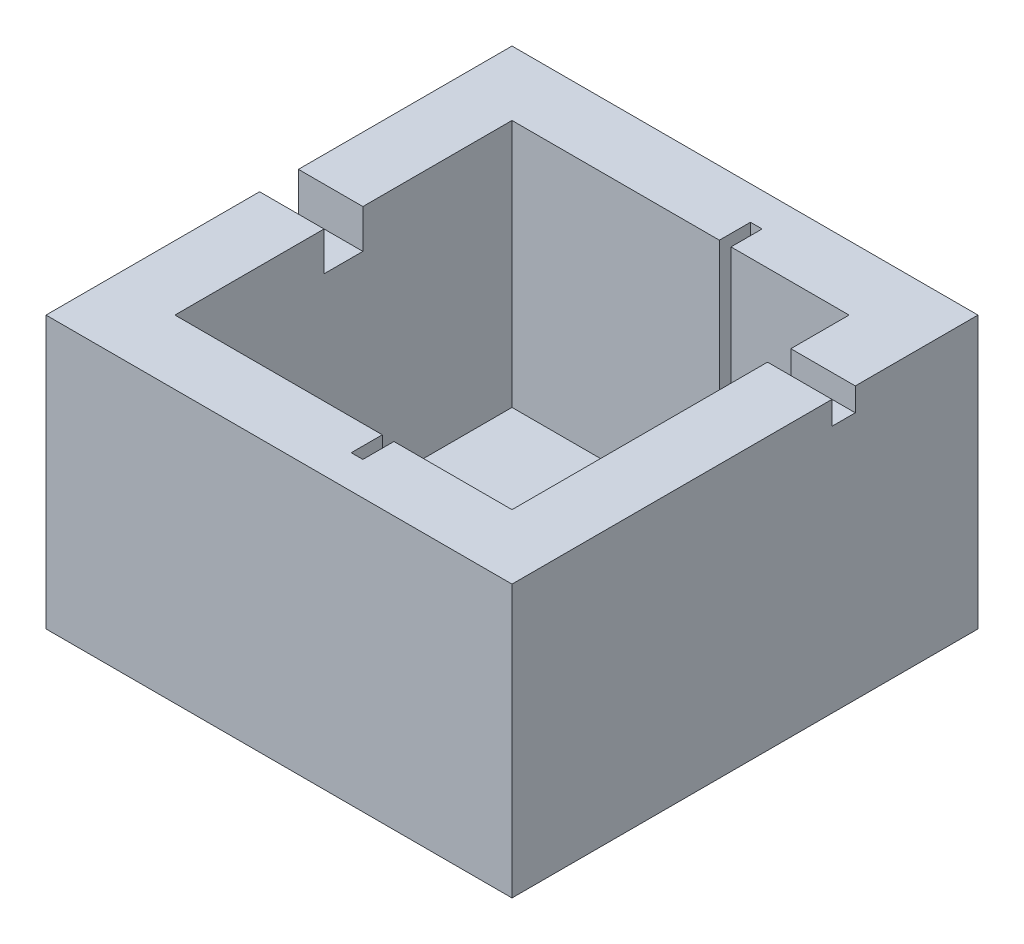
ISO-10303-21;
HEADER;
FILE_DESCRIPTION(('STEP AP214'),'2;1');
FILE_NAME('part.step','',(''),(''),'','','');
FILE_SCHEMA(('AUTOMOTIVE_DESIGN { 1 0 10303 214 1 1 1 1 }'));
ENDSEC;
DATA;
#1=APPLICATION_CONTEXT('core data for automotive mechanical design processes');
#2=APPLICATION_PROTOCOL_DEFINITION('international standard','automotive_design',2000,#1);
#3=PRODUCT_CONTEXT('',#1,'mechanical');
#4=PRODUCT('Part','Part','',(#3));
#5=PRODUCT_RELATED_PRODUCT_CATEGORY('part','',(#4));
#6=PRODUCT_DEFINITION_FORMATION('','',#4);
#7=PRODUCT_DEFINITION_CONTEXT('part definition',#1,'design');
#8=PRODUCT_DEFINITION('design','',#6,#7);
#9=PRODUCT_DEFINITION_SHAPE('','',#8);
#10=(LENGTH_UNIT() NAMED_UNIT(*) SI_UNIT(.MILLI.,.METRE.));
#11=(NAMED_UNIT(*) PLANE_ANGLE_UNIT() SI_UNIT($,.RADIAN.));
#12=(NAMED_UNIT(*) SI_UNIT($,.STERADIAN.) SOLID_ANGLE_UNIT());
#13=UNCERTAINTY_MEASURE_WITH_UNIT(LENGTH_MEASURE(1.E-05),#10,'distance_accuracy_value','');
#14=(GEOMETRIC_REPRESENTATION_CONTEXT(3) GLOBAL_UNCERTAINTY_ASSIGNED_CONTEXT((#13)) GLOBAL_UNIT_ASSIGNED_CONTEXT((#10,
#11,#12)) REPRESENTATION_CONTEXT('',''));
#15=CARTESIAN_POINT('',(0.,0.,0.));
#16=DIRECTION('',(0.,0.,1.));
#17=DIRECTION('',(1.,0.,0.));
#18=AXIS2_PLACEMENT_3D('',#15,#16,#17);
#19=CARTESIAN_POINT('',(0.,35.,0.));
#20=DIRECTION('',(0.,-1.,0.));
#21=DIRECTION('',(0.,0.,-1.));
#22=AXIS2_PLACEMENT_3D('',#19,#20,#21);
#23=PLANE('',#22);
#24=DIRECTION('',(0.,0.,-1.));
#25=VECTOR('',#24,1.);
#26=CARTESIAN_POINT('',(-25.9654028436019,35.,33.003317535545));
#27=LINE('',#26,#25);
#28=CARTESIAN_POINT('',(-25.9654028436019,35.,33.003317535545));
#29=VERTEX_POINT('',#28);
#30=CARTESIAN_POINT('',(-25.9654028436019,35.,13.803317535545));
#31=VERTEX_POINT('',#30);
#32=EDGE_CURVE('E258',#29,#31,#27,.T.);
#33=ORIENTED_EDGE('',*,*,#32,.T.);
#34=DIRECTION('',(-1.,0.,0.));
#35=VECTOR('',#34,1.);
#36=CARTESIAN_POINT('',(-23.0654028436019,35.,13.803317535545));
#37=LINE('',#36,#35);
#38=CARTESIAN_POINT('',(-34.2654028436019,35.,13.803317535545));
#39=VERTEX_POINT('',#38);
#40=EDGE_CURVE('E324',#31,#39,#37,.T.);
#41=ORIENTED_EDGE('',*,*,#40,.T.);
#42=DIRECTION('',(0.,0.,1.));
#43=VECTOR('',#42,1.);
#44=CARTESIAN_POINT('',(-34.2654028436019,35.,-18.696682464455));
#45=LINE('',#44,#43);
#46=CARTESIAN_POINT('',(-34.2654028436019,35.,41.303317535545));
#47=VERTEX_POINT('',#46);
#48=EDGE_CURVE('E218',#39,#47,#45,.T.);
#49=ORIENTED_EDGE('',*,*,#48,.T.);
#50=DIRECTION('',(1.,0.,0.));
#51=VECTOR('',#50,1.);
#52=CARTESIAN_POINT('',(-34.2654028436019,35.,41.303317535545));
#53=LINE('',#52,#51);
#54=CARTESIAN_POINT('',(25.7345971563981,35.,41.303317535545));
#55=VERTEX_POINT('',#54);
#56=EDGE_CURVE('E237',#47,#55,#53,.T.);
#57=ORIENTED_EDGE('',*,*,#56,.T.);
#58=DIRECTION('',(0.,0.,1.));
#59=VECTOR('',#58,1.);
#60=CARTESIAN_POINT('',(25.7345971563981,35.,-18.696682464455));
#61=LINE('',#60,#59);
#62=CARTESIAN_POINT('',(25.7345971563981,35.,0.103317535545015));
#63=VERTEX_POINT('',#62);
#64=EDGE_CURVE('E292',#63,#55,#61,.T.);
#65=ORIENTED_EDGE('',*,*,#64,.F.);
#66=DIRECTION('',(1.,0.,0.));
#67=VECTOR('',#66,1.);
#68=CARTESIAN_POINT('',(15.7345971563981,35.,0.103317535545015));
#69=LINE('',#68,#67);
#70=CARTESIAN_POINT('',(17.4345971563981,35.,0.103317535545015));
#71=VERTEX_POINT('',#70);
#72=EDGE_CURVE('E338',#71,#63,#69,.T.);
#73=ORIENTED_EDGE('',*,*,#72,.F.);
#74=DIRECTION('',(0.,0.,1.));
#75=VECTOR('',#74,1.);
#76=CARTESIAN_POINT('',(17.4345971563981,35.,-10.396682464455));
#77=LINE('',#76,#75);
#78=CARTESIAN_POINT('',(17.4345971563981,35.,33.003317535545));
#79=VERTEX_POINT('',#78);
#80=EDGE_CURVE('E272',#71,#79,#77,.T.);
#81=ORIENTED_EDGE('',*,*,#80,.T.);
#82=DIRECTION('',(-1.,0.,0.));
#83=VECTOR('',#82,1.);
#84=CARTESIAN_POINT('',(17.4345971563981,35.,33.003317535545));
#85=LINE('',#84,#83);
#86=CARTESIAN_POINT('',(2.23459715639813,35.,33.003317535545));
#87=VERTEX_POINT('',#86);
#88=EDGE_CURVE('E277',#79,#87,#85,.T.);
#89=ORIENTED_EDGE('',*,*,#88,.T.);
#90=DIRECTION('',(0.,0.,-1.));
#91=VECTOR('',#90,1.);
#92=CARTESIAN_POINT('',(2.23459715639813,35.,33.003317535545));
#93=LINE('',#92,#91);
#94=CARTESIAN_POINT('',(2.23459715639813,35.,37.003317535545));
#95=VERTEX_POINT('',#94);
#96=EDGE_CURVE('E375',#95,#87,#93,.T.);
#97=ORIENTED_EDGE('',*,*,#96,.F.);
#98=DIRECTION('',(1.,0.,0.));
#99=VECTOR('',#98,1.);
#100=CARTESIAN_POINT('',(2.23459715639813,35.,37.003317535545));
#101=LINE('',#100,#99);
#102=CARTESIAN_POINT('',(0.734597156398127,35.,37.003317535545));
#103=VERTEX_POINT('',#102);
#104=EDGE_CURVE('E372',#103,#95,#101,.T.);
#105=ORIENTED_EDGE('',*,*,#104,.F.);
#106=DIRECTION('',(0.,0.,1.));
#107=VECTOR('',#106,1.);
#108=CARTESIAN_POINT('',(0.734597156398127,35.,37.003317535545));
#109=LINE('',#108,#107);
#110=CARTESIAN_POINT('',(0.734597156398127,35.,33.003317535545));
#111=VERTEX_POINT('',#110);
#112=EDGE_CURVE('E370',#111,#103,#109,.T.);
#113=ORIENTED_EDGE('',*,*,#112,.F.);
#114=EDGE_CURVE('E276',#111,#29,#85,.T.);
#115=ORIENTED_EDGE('',*,*,#114,.T.);
#116=EDGE_LOOP('',(#33,#41,#49,#57,#65,#73,#81,#89,#97,#105,#113,#115));
#117=FACE_BOUND('',#116,.T.);
#118=ADVANCED_FACE('F33',(#117),#23,.F.);
#119=CARTESIAN_POINT('',(17.4345971563981,33.8,0.103317535545015));
#120=DIRECTION('',(0.,0.,1.));
#121=DIRECTION('',(1.,0.,0.));
#122=AXIS2_PLACEMENT_3D('',#119,#120,#121);
#123=PLANE('',#122);
#124=DIRECTION('',(1.,0.,0.));
#125=VECTOR('',#124,1.);
#126=CARTESIAN_POINT('',(25.7345971563981,32.,0.103317535545014));
#127=LINE('',#126,#125);
#128=CARTESIAN_POINT('',(17.4345971563981,32.,0.103317535545015));
#129=VERTEX_POINT('',#128);
#130=CARTESIAN_POINT('',(25.7345971563981,32.,0.103317535545014));
#131=VERTEX_POINT('',#130);
#132=EDGE_CURVE('E56',#129,#131,#127,.T.);
#133=ORIENTED_EDGE('',*,*,#132,.F.);
#134=DIRECTION('',(0.,-1.,0.));
#135=VECTOR('',#134,1.);
#136=CARTESIAN_POINT('',(17.4345971563981,33.8,0.103317535545015));
#137=LINE('',#136,#135);
#138=EDGE_CURVE('E344',#71,#129,#137,.T.);
#139=ORIENTED_EDGE('',*,*,#138,.F.);
#140=ORIENTED_EDGE('',*,*,#72,.T.);
#141=DIRECTION('',(0.,-1.,0.));
#142=VECTOR('',#141,1.);
#143=CARTESIAN_POINT('',(25.7345971563981,33.8,0.103317535545014));
#144=LINE('',#143,#142);
#145=EDGE_CURVE('E302',#63,#131,#144,.T.);
#146=ORIENTED_EDGE('',*,*,#145,.T.);
#147=EDGE_LOOP('',(#133,#139,#140,#146));
#148=FACE_BOUND('',#147,.T.);
#149=ADVANCED_FACE('F437',(#148),#123,.F.);
#150=CARTESIAN_POINT('',(17.4345971563981,30.8,-2.89668246445499));
#151=DIRECTION('',(0.,0.,-1.));
#152=DIRECTION('',(-1.,0.,0.));
#153=AXIS2_PLACEMENT_3D('',#150,#151,#152);
#154=PLANE('',#153);
#155=DIRECTION('',(-1.,0.,0.));
#156=VECTOR('',#155,1.);
#157=CARTESIAN_POINT('',(17.4345971563981,32.,-2.89668246445499));
#158=LINE('',#157,#156);
#159=CARTESIAN_POINT('',(25.7345971563981,32.,-2.89668246445499));
#160=VERTEX_POINT('',#159);
#161=CARTESIAN_POINT('',(17.4345971563981,32.,-2.89668246445499));
#162=VERTEX_POINT('',#161);
#163=EDGE_CURVE('E331',#160,#162,#158,.T.);
#164=ORIENTED_EDGE('',*,*,#163,.F.);
#165=DIRECTION('',(0.,1.,0.));
#166=VECTOR('',#165,1.);
#167=CARTESIAN_POINT('',(25.7345971563981,30.8,-2.89668246445499));
#168=LINE('',#167,#166);
#169=CARTESIAN_POINT('',(25.7345971563981,35.,-2.89668246445498));
#170=VERTEX_POINT('',#169);
#171=EDGE_CURVE('E340',#160,#170,#168,.T.);
#172=ORIENTED_EDGE('',*,*,#171,.T.);
#173=DIRECTION('',(1.,0.,0.));
#174=VECTOR('',#173,1.);
#175=CARTESIAN_POINT('',(15.7345971563981,35.,-2.89668246445498));
#176=LINE('',#175,#174);
#177=CARTESIAN_POINT('',(17.4345971563981,35.,-2.89668246445498));
#178=VERTEX_POINT('',#177);
#179=EDGE_CURVE('E318',#178,#170,#176,.T.);
#180=ORIENTED_EDGE('',*,*,#179,.F.);
#181=DIRECTION('',(0.,1.,0.));
#182=VECTOR('',#181,1.);
#183=CARTESIAN_POINT('',(17.4345971563981,30.8,-2.89668246445499));
#184=LINE('',#183,#182);
#185=EDGE_CURVE('E342',#162,#178,#184,.T.);
#186=ORIENTED_EDGE('',*,*,#185,.F.);
#187=EDGE_LOOP('',(#164,#172,#180,#186));
#188=FACE_BOUND('',#187,.T.);
#189=ADVANCED_FACE('F442',(#188),#154,.F.);
#190=CARTESIAN_POINT('',(-34.2654028436019,35.,-18.696682464455));
#191=VERTEX_POINT('',#190);
#192=CARTESIAN_POINT('',(-34.2654028436019,35.,8.80331753554502));
#193=VERTEX_POINT('',#192);
#194=EDGE_CURVE('E207',#191,#193,#45,.T.);
#195=ORIENTED_EDGE('',*,*,#194,.T.);
#196=DIRECTION('',(-1.,0.,0.));
#197=VECTOR('',#196,1.);
#198=CARTESIAN_POINT('',(-23.0654028436019,35.,8.80331753554502));
#199=LINE('',#198,#197);
#200=CARTESIAN_POINT('',(-25.9654028436019,35.,8.80331753554502));
#201=VERTEX_POINT('',#200);
#202=EDGE_CURVE('E191',#201,#193,#199,.T.);
#203=ORIENTED_EDGE('',*,*,#202,.F.);
#204=CARTESIAN_POINT('',(-25.9654028436019,35.,-10.396682464455));
#205=VERTEX_POINT('',#204);
#206=EDGE_CURVE('E253',#201,#205,#27,.T.);
#207=ORIENTED_EDGE('',*,*,#206,.T.);
#208=DIRECTION('',(1.,0.,0.));
#209=VECTOR('',#208,1.);
#210=CARTESIAN_POINT('',(-25.9654028436019,35.,-10.396682464455));
#211=LINE('',#210,#209);
#212=CARTESIAN_POINT('',(0.734597156398126,35.,-10.396682464455));
#213=VERTEX_POINT('',#212);
#214=EDGE_CURVE('E270',#205,#213,#211,.T.);
#215=ORIENTED_EDGE('',*,*,#214,.T.);
#216=DIRECTION('',(0.,0.,1.));
#217=VECTOR('',#216,1.);
#218=CARTESIAN_POINT('',(0.734597156398126,35.,-10.396682464455));
#219=LINE('',#218,#217);
#220=CARTESIAN_POINT('',(0.734597156398126,35.,-14.396682464455));
#221=VERTEX_POINT('',#220);
#222=EDGE_CURVE('E354',#221,#213,#219,.T.);
#223=ORIENTED_EDGE('',*,*,#222,.F.);
#224=DIRECTION('',(-1.,0.,0.));
#225=VECTOR('',#224,1.);
#226=CARTESIAN_POINT('',(0.734597156398126,35.,-14.396682464455));
#227=LINE('',#226,#225);
#228=CARTESIAN_POINT('',(2.23459715639813,35.,-14.396682464455));
#229=VERTEX_POINT('',#228);
#230=EDGE_CURVE('E351',#229,#221,#227,.T.);
#231=ORIENTED_EDGE('',*,*,#230,.F.);
#232=DIRECTION('',(0.,0.,-1.));
#233=VECTOR('',#232,1.);
#234=CARTESIAN_POINT('',(2.23459715639813,35.,-14.396682464455));
#235=LINE('',#234,#233);
#236=CARTESIAN_POINT('',(2.23459715639813,35.,-10.396682464455));
#237=VERTEX_POINT('',#236);
#238=EDGE_CURVE('E349',#237,#229,#235,.T.);
#239=ORIENTED_EDGE('',*,*,#238,.F.);
#240=CARTESIAN_POINT('',(17.4345971563981,35.,-10.396682464455));
#241=VERTEX_POINT('',#240);
#242=EDGE_CURVE('E262',#237,#241,#211,.T.);
#243=ORIENTED_EDGE('',*,*,#242,.T.);
#244=EDGE_CURVE('E273',#241,#178,#77,.T.);
#245=ORIENTED_EDGE('',*,*,#244,.T.);
#246=ORIENTED_EDGE('',*,*,#179,.T.);
#247=CARTESIAN_POINT('',(25.7345971563981,35.,-18.696682464455));
#248=VERTEX_POINT('',#247);
#249=EDGE_CURVE('E293',#248,#170,#61,.T.);
#250=ORIENTED_EDGE('',*,*,#249,.F.);
#251=DIRECTION('',(1.,0.,0.));
#252=VECTOR('',#251,1.);
#253=CARTESIAN_POINT('',(-34.2654028436019,35.,-18.696682464455));
#254=LINE('',#253,#252);
#255=EDGE_CURVE('E216',#191,#248,#254,.T.);
#256=ORIENTED_EDGE('',*,*,#255,.F.);
#257=EDGE_LOOP('',(#195,#203,#207,#215,#223,#231,#239,#243,#245,#246,#250,#256));
#258=FACE_BOUND('',#257,.T.);
#259=ADVANCED_FACE('F213',(#258),#23,.F.);
#260=CARTESIAN_POINT('',(-25.9654028436019,3.,-10.396682464455));
#261=DIRECTION('',(0.,0.,1.));
#262=DIRECTION('',(1.,0.,0.));
#263=AXIS2_PLACEMENT_3D('',#260,#261,#262);
#264=PLANE('',#263);
#265=ORIENTED_EDGE('',*,*,#242,.F.);
#266=DIRECTION('',(0.,-1.,0.));
#267=VECTOR('',#266,1.);
#268=CARTESIAN_POINT('',(2.23459715639813,35.,-10.396682464455));
#269=LINE('',#268,#267);
#270=CARTESIAN_POINT('',(2.23459715639813,3.,-10.396682464455));
#271=VERTEX_POINT('',#270);
#272=EDGE_CURVE('E259',#237,#271,#269,.T.);
#273=ORIENTED_EDGE('',*,*,#272,.T.);
#274=DIRECTION('',(1.,0.,0.));
#275=VECTOR('',#274,1.);
#276=CARTESIAN_POINT('',(-25.9654028436019,3.,-10.396682464455));
#277=LINE('',#276,#275);
#278=CARTESIAN_POINT('',(17.4345971563981,3.,-10.396682464455));
#279=VERTEX_POINT('',#278);
#280=EDGE_CURVE('E394',#271,#279,#277,.T.);
#281=ORIENTED_EDGE('',*,*,#280,.T.);
#282=DIRECTION('',(0.,1.,0.));
#283=VECTOR('',#282,1.);
#284=CARTESIAN_POINT('',(17.4345971563981,3.,-10.396682464455));
#285=LINE('',#284,#283);
#286=EDGE_CURVE('E287',#279,#241,#285,.T.);
#287=ORIENTED_EDGE('',*,*,#286,.T.);
#288=EDGE_LOOP('',(#265,#273,#281,#287));
#289=FACE_BOUND('',#288,.T.);
#290=ADVANCED_FACE('F446',(#289),#264,.T.);
#291=CARTESIAN_POINT('',(-25.9654028436019,3.,-10.396682464455));
#292=VERTEX_POINT('',#291);
#293=CARTESIAN_POINT('',(0.734597156398127,3.,-10.396682464455));
#294=VERTEX_POINT('',#293);
#295=EDGE_CURVE('E395',#292,#294,#277,.T.);
#296=ORIENTED_EDGE('',*,*,#295,.T.);
#297=DIRECTION('',(0.,-1.,0.));
#298=VECTOR('',#297,1.);
#299=CARTESIAN_POINT('',(0.734597156398126,35.,-10.396682464455));
#300=LINE('',#299,#298);
#301=EDGE_CURVE('E356',#213,#294,#300,.T.);
#302=ORIENTED_EDGE('',*,*,#301,.F.);
#303=ORIENTED_EDGE('',*,*,#214,.F.);
#304=DIRECTION('',(0.,1.,0.));
#305=VECTOR('',#304,1.);
#306=CARTESIAN_POINT('',(-25.9654028436019,3.,-10.396682464455));
#307=LINE('',#306,#305);
#308=EDGE_CURVE('E230',#292,#205,#307,.T.);
#309=ORIENTED_EDGE('',*,*,#308,.F.);
#310=EDGE_LOOP('',(#296,#302,#303,#309));
#311=FACE_BOUND('',#310,.T.);
#312=ADVANCED_FACE('F451',(#311),#264,.T.);
#313=CARTESIAN_POINT('',(17.4345971563981,3.,33.003317535545));
#314=DIRECTION('',(0.,0.,-1.));
#315=DIRECTION('',(-1.,0.,0.));
#316=AXIS2_PLACEMENT_3D('',#313,#314,#315);
#317=PLANE('',#316);
#318=ORIENTED_EDGE('',*,*,#114,.F.);
#319=DIRECTION('',(0.,-1.,0.));
#320=VECTOR('',#319,1.);
#321=CARTESIAN_POINT('',(0.734597156398127,35.,33.003317535545));
#322=LINE('',#321,#320);
#323=CARTESIAN_POINT('',(0.734597156398127,3.,33.003317535545));
#324=VERTEX_POINT('',#323);
#325=EDGE_CURVE('E377',#111,#324,#322,.T.);
#326=ORIENTED_EDGE('',*,*,#325,.T.);
#327=DIRECTION('',(-1.,0.,0.));
#328=VECTOR('',#327,1.);
#329=CARTESIAN_POINT('',(17.4345971563981,3.,33.003317535545));
#330=LINE('',#329,#328);
#331=CARTESIAN_POINT('',(-25.9654028436019,3.,33.003317535545));
#332=VERTEX_POINT('',#331);
#333=EDGE_CURVE('E398',#324,#332,#330,.T.);
#334=ORIENTED_EDGE('',*,*,#333,.T.);
#335=DIRECTION('',(0.,1.,0.));
#336=VECTOR('',#335,1.);
#337=CARTESIAN_POINT('',(-25.9654028436019,3.,33.003317535545));
#338=LINE('',#337,#336);
#339=EDGE_CURVE('E281',#332,#29,#338,.T.);
#340=ORIENTED_EDGE('',*,*,#339,.T.);
#341=EDGE_LOOP('',(#318,#326,#334,#340));
#342=FACE_BOUND('',#341,.T.);
#343=ADVANCED_FACE('F480',(#342),#317,.T.);
#344=CARTESIAN_POINT('',(17.4345971563981,3.,33.003317535545));
#345=VERTEX_POINT('',#344);
#346=CARTESIAN_POINT('',(2.23459715639813,3.,33.003317535545));
#347=VERTEX_POINT('',#346);
#348=EDGE_CURVE('E268',#345,#347,#330,.T.);
#349=ORIENTED_EDGE('',*,*,#348,.T.);
#350=DIRECTION('',(0.,-1.,0.));
#351=VECTOR('',#350,1.);
#352=CARTESIAN_POINT('',(2.23459715639813,35.,33.003317535545));
#353=LINE('',#352,#351);
#354=EDGE_CURVE('E386',#87,#347,#353,.T.);
#355=ORIENTED_EDGE('',*,*,#354,.F.);
#356=ORIENTED_EDGE('',*,*,#88,.F.);
#357=DIRECTION('',(0.,1.,0.));
#358=VECTOR('',#357,1.);
#359=CARTESIAN_POINT('',(17.4345971563981,3.,33.003317535545));
#360=LINE('',#359,#358);
#361=EDGE_CURVE('E284',#345,#79,#360,.T.);
#362=ORIENTED_EDGE('',*,*,#361,.F.);
#363=EDGE_LOOP('',(#349,#355,#356,#362));
#364=FACE_BOUND('',#363,.T.);
#365=ADVANCED_FACE('F410',(#364),#317,.T.);
#366=CARTESIAN_POINT('',(-34.2654028436019,35.,41.303317535545));
#367=DIRECTION('',(0.,0.,-1.));
#368=DIRECTION('',(-1.,0.,0.));
#369=AXIS2_PLACEMENT_3D('',#366,#367,#368);
#370=PLANE('',#369);
#371=DIRECTION('',(1.,0.,0.));
#372=VECTOR('',#371,1.);
#373=CARTESIAN_POINT('',(-34.2654028436019,0.,41.303317535545));
#374=LINE('',#373,#372);
#375=CARTESIAN_POINT('',(-34.2654028436019,0.,41.303317535545));
#376=VERTEX_POINT('',#375);
#377=CARTESIAN_POINT('',(25.7345971563981,0.,41.303317535545));
#378=VERTEX_POINT('',#377);
#379=EDGE_CURVE('E226',#376,#378,#374,.T.);
#380=ORIENTED_EDGE('',*,*,#379,.T.);
#381=DIRECTION('',(0.,-1.,0.));
#382=VECTOR('',#381,1.);
#383=CARTESIAN_POINT('',(25.7345971563981,35.,41.303317535545));
#384=LINE('',#383,#382);
#385=EDGE_CURVE('E242',#55,#378,#384,.T.);
#386=ORIENTED_EDGE('',*,*,#385,.F.);
#387=ORIENTED_EDGE('',*,*,#56,.F.);
#388=DIRECTION('',(0.,-1.,0.));
#389=VECTOR('',#388,1.);
#390=CARTESIAN_POINT('',(-34.2654028436019,35.,41.303317535545));
#391=LINE('',#390,#389);
#392=EDGE_CURVE('E217',#47,#376,#391,.T.);
#393=ORIENTED_EDGE('',*,*,#392,.T.);
#394=EDGE_LOOP('',(#380,#386,#387,#393));
#395=FACE_BOUND('',#394,.T.);
#396=ADVANCED_FACE('F35',(#395),#370,.F.);
#397=CARTESIAN_POINT('',(25.7345971563981,35.,-18.696682464455));
#398=DIRECTION('',(1.,0.,0.));
#399=DIRECTION('',(0.,0.,-1.));
#400=AXIS2_PLACEMENT_3D('',#397,#398,#399);
#401=PLANE('',#400);
#402=ORIENTED_EDGE('',*,*,#145,.F.);
#403=ORIENTED_EDGE('',*,*,#64,.T.);
#404=ORIENTED_EDGE('',*,*,#385,.T.);
#405=DIRECTION('',(0.,0.,1.));
#406=VECTOR('',#405,1.);
#407=CARTESIAN_POINT('',(25.7345971563981,0.,-18.696682464455));
#408=LINE('',#407,#406);
#409=CARTESIAN_POINT('',(25.7345971563981,0.,-18.696682464455));
#410=VERTEX_POINT('',#409);
#411=EDGE_CURVE('E229',#410,#378,#408,.T.);
#412=ORIENTED_EDGE('',*,*,#411,.F.);
#413=DIRECTION('',(0.,-1.,0.));
#414=VECTOR('',#413,1.);
#415=CARTESIAN_POINT('',(25.7345971563981,35.,-18.696682464455));
#416=LINE('',#415,#414);
#417=EDGE_CURVE('E240',#248,#410,#416,.T.);
#418=ORIENTED_EDGE('',*,*,#417,.F.);
#419=ORIENTED_EDGE('',*,*,#249,.T.);
#420=ORIENTED_EDGE('',*,*,#171,.F.);
#421=DIRECTION('',(0.,0.,-1.));
#422=VECTOR('',#421,1.);
#423=CARTESIAN_POINT('',(25.7345971563981,32.,-2.89668246445498));
#424=LINE('',#423,#422);
#425=EDGE_CURVE('E326',#131,#160,#424,.T.);
#426=ORIENTED_EDGE('',*,*,#425,.F.);
#427=EDGE_LOOP('',(#402,#403,#404,#412,#418,#419,#420,#426));
#428=FACE_BOUND('',#427,.T.);
#429=ADVANCED_FACE('F298',(#428),#401,.T.);
#430=CARTESIAN_POINT('',(-34.2654028436019,35.,-18.696682464455));
#431=DIRECTION('',(0.,0.,-1.));
#432=DIRECTION('',(-1.,0.,0.));
#433=AXIS2_PLACEMENT_3D('',#430,#431,#432);
#434=PLANE('',#433);
#435=DIRECTION('',(1.,0.,0.));
#436=VECTOR('',#435,1.);
#437=CARTESIAN_POINT('',(-34.2654028436019,0.,-18.696682464455));
#438=LINE('',#437,#436);
#439=CARTESIAN_POINT('',(-34.2654028436019,0.,-18.696682464455));
#440=VERTEX_POINT('',#439);
#441=EDGE_CURVE('E233',#440,#410,#438,.T.);
#442=ORIENTED_EDGE('',*,*,#441,.F.);
#443=DIRECTION('',(0.,-1.,0.));
#444=VECTOR('',#443,1.);
#445=CARTESIAN_POINT('',(-34.2654028436019,35.,-18.696682464455));
#446=LINE('',#445,#444);
#447=EDGE_CURVE('E221',#191,#440,#446,.T.);
#448=ORIENTED_EDGE('',*,*,#447,.F.);
#449=ORIENTED_EDGE('',*,*,#255,.T.);
#450=ORIENTED_EDGE('',*,*,#417,.T.);
#451=EDGE_LOOP('',(#442,#448,#449,#450));
#452=FACE_BOUND('',#451,.T.);
#453=ADVANCED_FACE('F319',(#452),#434,.T.);
#454=CARTESIAN_POINT('',(-34.2654028436019,35.,-18.696682464455));
#455=DIRECTION('',(1.,0.,0.));
#456=DIRECTION('',(0.,0.,-1.));
#457=AXIS2_PLACEMENT_3D('',#454,#455,#456);
#458=PLANE('',#457);
#459=ORIENTED_EDGE('',*,*,#48,.F.);
#460=DIRECTION('',(0.,1.,0.));
#461=VECTOR('',#460,1.);
#462=CARTESIAN_POINT('',(-34.2654028436019,30.,13.803317535545));
#463=LINE('',#462,#461);
#464=CARTESIAN_POINT('',(-34.2654028436019,30.,13.803317535545));
#465=VERTEX_POINT('',#464);
#466=EDGE_CURVE('E201',#465,#39,#463,.T.);
#467=ORIENTED_EDGE('',*,*,#466,.F.);
#468=DIRECTION('',(0.,0.,1.));
#469=VECTOR('',#468,1.);
#470=CARTESIAN_POINT('',(-34.2654028436019,30.,8.80331753554502));
#471=LINE('',#470,#469);
#472=CARTESIAN_POINT('',(-34.2654028436019,30.,8.80331753554502));
#473=VERTEX_POINT('',#472);
#474=EDGE_CURVE('E211',#473,#465,#471,.T.);
#475=ORIENTED_EDGE('',*,*,#474,.F.);
#476=DIRECTION('',(0.,-1.,0.));
#477=VECTOR('',#476,1.);
#478=CARTESIAN_POINT('',(-34.2654028436019,35.,8.80331753554502));
#479=LINE('',#478,#477);
#480=EDGE_CURVE('E194',#193,#473,#479,.T.);
#481=ORIENTED_EDGE('',*,*,#480,.F.);
#482=ORIENTED_EDGE('',*,*,#194,.F.);
#483=ORIENTED_EDGE('',*,*,#447,.T.);
#484=DIRECTION('',(0.,0.,1.));
#485=VECTOR('',#484,1.);
#486=CARTESIAN_POINT('',(-34.2654028436019,0.,-18.696682464455));
#487=LINE('',#486,#485);
#488=EDGE_CURVE('E236',#440,#376,#487,.T.);
#489=ORIENTED_EDGE('',*,*,#488,.T.);
#490=ORIENTED_EDGE('',*,*,#392,.F.);
#491=EDGE_LOOP('',(#459,#467,#475,#481,#482,#483,#489,#490));
#492=FACE_BOUND('',#491,.T.);
#493=ADVANCED_FACE('F206',(#492),#458,.F.);
#494=CARTESIAN_POINT('',(0.,0.,0.));
#495=DIRECTION('',(0.,-1.,0.));
#496=DIRECTION('',(0.,0.,-1.));
#497=AXIS2_PLACEMENT_3D('',#494,#495,#496);
#498=PLANE('',#497);
#499=ORIENTED_EDGE('',*,*,#379,.F.);
#500=ORIENTED_EDGE('',*,*,#488,.F.);
#501=ORIENTED_EDGE('',*,*,#441,.T.);
#502=ORIENTED_EDGE('',*,*,#411,.T.);
#503=EDGE_LOOP('',(#499,#500,#501,#502));
#504=FACE_BOUND('',#503,.T.);
#505=ADVANCED_FACE('F313',(#504),#498,.T.);
#506=CARTESIAN_POINT('',(-25.9654028436019,3.,33.003317535545));
#507=DIRECTION('',(1.,0.,0.));
#508=DIRECTION('',(0.,0.,-1.));
#509=AXIS2_PLACEMENT_3D('',#506,#507,#508);
#510=PLANE('',#509);
#511=DIRECTION('',(0.,-1.,0.));
#512=VECTOR('',#511,1.);
#513=CARTESIAN_POINT('',(-25.9654028436019,3.,13.803317535545));
#514=LINE('',#513,#512);
#515=CARTESIAN_POINT('',(-25.9654028436019,30.,13.803317535545));
#516=VERTEX_POINT('',#515);
#517=EDGE_CURVE('E11',#31,#516,#514,.T.);
#518=ORIENTED_EDGE('',*,*,#517,.F.);
#519=ORIENTED_EDGE('',*,*,#32,.F.);
#520=ORIENTED_EDGE('',*,*,#339,.F.);
#521=DIRECTION('',(0.,0.,-1.));
#522=VECTOR('',#521,1.);
#523=CARTESIAN_POINT('',(-25.9654028436019,3.,33.003317535545));
#524=LINE('',#523,#522);
#525=EDGE_CURVE('E280',#332,#292,#524,.T.);
#526=ORIENTED_EDGE('',*,*,#525,.T.);
#527=ORIENTED_EDGE('',*,*,#308,.T.);
#528=ORIENTED_EDGE('',*,*,#206,.F.);
#529=DIRECTION('',(0.,1.,0.));
#530=VECTOR('',#529,1.);
#531=CARTESIAN_POINT('',(-25.9654028436019,3.,8.80331753554502));
#532=LINE('',#531,#530);
#533=CARTESIAN_POINT('',(-25.9654028436019,30.,8.80331753554502));
#534=VERTEX_POINT('',#533);
#535=EDGE_CURVE('E197',#534,#201,#532,.T.);
#536=ORIENTED_EDGE('',*,*,#535,.F.);
#537=DIRECTION('',(0.,0.,-1.));
#538=VECTOR('',#537,1.);
#539=CARTESIAN_POINT('',(-25.9654028436019,30.,33.003317535545));
#540=LINE('',#539,#538);
#541=EDGE_CURVE('E41',#516,#534,#540,.T.);
#542=ORIENTED_EDGE('',*,*,#541,.F.);
#543=EDGE_LOOP('',(#518,#519,#520,#526,#527,#528,#536,#542));
#544=FACE_BOUND('',#543,.T.);
#545=ADVANCED_FACE('F251',(#544),#510,.T.);
#546=CARTESIAN_POINT('',(17.4345971563981,3.,-10.396682464455));
#547=DIRECTION('',(-1.,0.,0.));
#548=DIRECTION('',(0.,0.,1.));
#549=AXIS2_PLACEMENT_3D('',#546,#547,#548);
#550=PLANE('',#549);
#551=ORIENTED_EDGE('',*,*,#80,.F.);
#552=ORIENTED_EDGE('',*,*,#138,.T.);
#553=DIRECTION('',(0.,0.,1.));
#554=VECTOR('',#553,1.);
#555=CARTESIAN_POINT('',(17.4345971563981,32.,0.103317535545015));
#556=LINE('',#555,#554);
#557=EDGE_CURVE('E334',#162,#129,#556,.T.);
#558=ORIENTED_EDGE('',*,*,#557,.F.);
#559=ORIENTED_EDGE('',*,*,#185,.T.);
#560=ORIENTED_EDGE('',*,*,#244,.F.);
#561=ORIENTED_EDGE('',*,*,#286,.F.);
#562=DIRECTION('',(0.,0.,1.));
#563=VECTOR('',#562,1.);
#564=CARTESIAN_POINT('',(17.4345971563981,3.,-10.396682464455));
#565=LINE('',#564,#563);
#566=EDGE_CURVE('E397',#279,#345,#565,.T.);
#567=ORIENTED_EDGE('',*,*,#566,.T.);
#568=ORIENTED_EDGE('',*,*,#361,.T.);
#569=EDGE_LOOP('',(#551,#552,#558,#559,#560,#561,#567,#568));
#570=FACE_BOUND('',#569,.T.);
#571=ADVANCED_FACE('F424',(#570),#550,.T.);
#572=CARTESIAN_POINT('',(0.,3.,0.));
#573=DIRECTION('',(0.,-1.,0.));
#574=DIRECTION('',(0.,0.,-1.));
#575=AXIS2_PLACEMENT_3D('',#572,#573,#574);
#576=PLANE('',#575);
#577=ORIENTED_EDGE('',*,*,#525,.F.);
#578=ORIENTED_EDGE('',*,*,#333,.F.);
#579=DIRECTION('',(0.,0.,1.));
#580=VECTOR('',#579,1.);
#581=CARTESIAN_POINT('',(0.734597156398127,3.,37.003317535545));
#582=LINE('',#581,#580);
#583=CARTESIAN_POINT('',(0.734597156398127,3.,37.003317535545));
#584=VERTEX_POINT('',#583);
#585=EDGE_CURVE('E346',#324,#584,#582,.T.);
#586=ORIENTED_EDGE('',*,*,#585,.T.);
#587=DIRECTION('',(1.,0.,0.));
#588=VECTOR('',#587,1.);
#589=CARTESIAN_POINT('',(2.23459715639813,3.,37.003317535545));
#590=LINE('',#589,#588);
#591=CARTESIAN_POINT('',(2.23459715639813,3.,37.003317535545));
#592=VERTEX_POINT('',#591);
#593=EDGE_CURVE('E380',#584,#592,#590,.T.);
#594=ORIENTED_EDGE('',*,*,#593,.T.);
#595=DIRECTION('',(0.,0.,-1.));
#596=VECTOR('',#595,1.);
#597=CARTESIAN_POINT('',(2.23459715639813,3.,33.003317535545));
#598=LINE('',#597,#596);
#599=EDGE_CURVE('E373',#592,#347,#598,.T.);
#600=ORIENTED_EDGE('',*,*,#599,.T.);
#601=ORIENTED_EDGE('',*,*,#348,.F.);
#602=ORIENTED_EDGE('',*,*,#566,.F.);
#603=ORIENTED_EDGE('',*,*,#280,.F.);
#604=DIRECTION('',(0.,0.,-1.));
#605=VECTOR('',#604,1.);
#606=CARTESIAN_POINT('',(2.23459715639813,3.,-14.396682464455));
#607=LINE('',#606,#605);
#608=CARTESIAN_POINT('',(2.23459715639813,3.,-14.396682464455));
#609=VERTEX_POINT('',#608);
#610=EDGE_CURVE('E357',#271,#609,#607,.T.);
#611=ORIENTED_EDGE('',*,*,#610,.T.);
#612=DIRECTION('',(-1.,0.,0.));
#613=VECTOR('',#612,1.);
#614=CARTESIAN_POINT('',(0.734597156398126,3.,-14.396682464455));
#615=LINE('',#614,#613);
#616=CARTESIAN_POINT('',(0.734597156398126,3.,-14.396682464455));
#617=VERTEX_POINT('',#616);
#618=EDGE_CURVE('E359',#609,#617,#615,.T.);
#619=ORIENTED_EDGE('',*,*,#618,.T.);
#620=DIRECTION('',(0.,0.,1.));
#621=VECTOR('',#620,1.);
#622=CARTESIAN_POINT('',(0.734597156398126,3.,-10.396682464455));
#623=LINE('',#622,#621);
#624=EDGE_CURVE('E352',#617,#294,#623,.T.);
#625=ORIENTED_EDGE('',*,*,#624,.T.);
#626=ORIENTED_EDGE('',*,*,#295,.F.);
#627=EDGE_LOOP('',(#577,#578,#586,#594,#600,#601,#602,#603,#611,#619,#625,#626));
#628=FACE_BOUND('',#627,.T.);
#629=ADVANCED_FACE('F414',(#628),#576,.F.);
#630=CARTESIAN_POINT('',(0.734597156398127,35.,37.003317535545));
#631=DIRECTION('',(1.,0.,0.));
#632=DIRECTION('',(0.,0.,-1.));
#633=AXIS2_PLACEMENT_3D('',#630,#631,#632);
#634=PLANE('',#633);
#635=ORIENTED_EDGE('',*,*,#585,.F.);
#636=ORIENTED_EDGE('',*,*,#325,.F.);
#637=ORIENTED_EDGE('',*,*,#112,.T.);
#638=DIRECTION('',(0.,-1.,0.));
#639=VECTOR('',#638,1.);
#640=CARTESIAN_POINT('',(0.734597156398127,35.,37.003317535545));
#641=LINE('',#640,#639);
#642=EDGE_CURVE('E360',#103,#584,#641,.T.);
#643=ORIENTED_EDGE('',*,*,#642,.T.);
#644=EDGE_LOOP('',(#635,#636,#637,#643));
#645=FACE_BOUND('',#644,.T.);
#646=ADVANCED_FACE('F431',(#645),#634,.T.);
#647=CARTESIAN_POINT('',(2.23459715639813,35.,37.003317535545));
#648=DIRECTION('',(0.,0.,-1.));
#649=DIRECTION('',(-1.,0.,0.));
#650=AXIS2_PLACEMENT_3D('',#647,#648,#649);
#651=PLANE('',#650);
#652=ORIENTED_EDGE('',*,*,#593,.F.);
#653=ORIENTED_EDGE('',*,*,#642,.F.);
#654=ORIENTED_EDGE('',*,*,#104,.T.);
#655=DIRECTION('',(0.,-1.,0.));
#656=VECTOR('',#655,1.);
#657=CARTESIAN_POINT('',(2.23459715639813,35.,37.003317535545));
#658=LINE('',#657,#656);
#659=EDGE_CURVE('E388',#95,#592,#658,.T.);
#660=ORIENTED_EDGE('',*,*,#659,.T.);
#661=EDGE_LOOP('',(#652,#653,#654,#660));
#662=FACE_BOUND('',#661,.T.);
#663=ADVANCED_FACE('F474',(#662),#651,.T.);
#664=CARTESIAN_POINT('',(2.23459715639813,35.,33.003317535545));
#665=DIRECTION('',(-1.,0.,0.));
#666=DIRECTION('',(0.,0.,1.));
#667=AXIS2_PLACEMENT_3D('',#664,#665,#666);
#668=PLANE('',#667);
#669=ORIENTED_EDGE('',*,*,#599,.F.);
#670=ORIENTED_EDGE('',*,*,#659,.F.);
#671=ORIENTED_EDGE('',*,*,#96,.T.);
#672=ORIENTED_EDGE('',*,*,#354,.T.);
#673=EDGE_LOOP('',(#669,#670,#671,#672));
#674=FACE_BOUND('',#673,.T.);
#675=ADVANCED_FACE('F419',(#674),#668,.T.);
#676=CARTESIAN_POINT('',(2.23459715639813,35.,-14.396682464455));
#677=DIRECTION('',(-1.,0.,0.));
#678=DIRECTION('',(0.,0.,1.));
#679=AXIS2_PLACEMENT_3D('',#676,#677,#678);
#680=PLANE('',#679);
#681=ORIENTED_EDGE('',*,*,#610,.F.);
#682=ORIENTED_EDGE('',*,*,#272,.F.);
#683=ORIENTED_EDGE('',*,*,#238,.T.);
#684=DIRECTION('',(0.,-1.,0.));
#685=VECTOR('',#684,1.);
#686=CARTESIAN_POINT('',(2.23459715639813,35.,-14.396682464455));
#687=LINE('',#686,#685);
#688=EDGE_CURVE('E264',#229,#609,#687,.T.);
#689=ORIENTED_EDGE('',*,*,#688,.T.);
#690=EDGE_LOOP('',(#681,#682,#683,#689));
#691=FACE_BOUND('',#690,.T.);
#692=ADVANCED_FACE('F467',(#691),#680,.T.);
#693=CARTESIAN_POINT('',(0.734597156398126,35.,-14.396682464455));
#694=DIRECTION('',(0.,0.,1.));
#695=DIRECTION('',(1.,0.,0.));
#696=AXIS2_PLACEMENT_3D('',#693,#694,#695);
#697=PLANE('',#696);
#698=ORIENTED_EDGE('',*,*,#618,.F.);
#699=ORIENTED_EDGE('',*,*,#688,.F.);
#700=ORIENTED_EDGE('',*,*,#230,.T.);
#701=DIRECTION('',(0.,-1.,0.));
#702=VECTOR('',#701,1.);
#703=CARTESIAN_POINT('',(0.734597156398126,35.,-14.396682464455));
#704=LINE('',#703,#702);
#705=EDGE_CURVE('E365',#221,#617,#704,.T.);
#706=ORIENTED_EDGE('',*,*,#705,.T.);
#707=EDGE_LOOP('',(#698,#699,#700,#706));
#708=FACE_BOUND('',#707,.T.);
#709=ADVANCED_FACE('F463',(#708),#697,.T.);
#710=CARTESIAN_POINT('',(0.734597156398126,35.,-10.396682464455));
#711=DIRECTION('',(1.,0.,0.));
#712=DIRECTION('',(0.,0.,-1.));
#713=AXIS2_PLACEMENT_3D('',#710,#711,#712);
#714=PLANE('',#713);
#715=ORIENTED_EDGE('',*,*,#624,.F.);
#716=ORIENTED_EDGE('',*,*,#705,.F.);
#717=ORIENTED_EDGE('',*,*,#222,.T.);
#718=ORIENTED_EDGE('',*,*,#301,.T.);
#719=EDGE_LOOP('',(#715,#716,#717,#718));
#720=FACE_BOUND('',#719,.T.);
#721=ADVANCED_FACE('F459',(#720),#714,.T.);
#722=CARTESIAN_POINT('',(0.,32.,0.));
#723=DIRECTION('',(0.,-1.,0.));
#724=DIRECTION('',(0.,0.,-1.));
#725=AXIS2_PLACEMENT_3D('',#722,#723,#724);
#726=PLANE('',#725);
#727=ORIENTED_EDGE('',*,*,#425,.T.);
#728=ORIENTED_EDGE('',*,*,#163,.T.);
#729=ORIENTED_EDGE('',*,*,#557,.T.);
#730=ORIENTED_EDGE('',*,*,#132,.T.);
#731=EDGE_LOOP('',(#727,#728,#729,#730));
#732=FACE_BOUND('',#731,.T.);
#733=ADVANCED_FACE('F462',(#732),#726,.F.);
#734=CARTESIAN_POINT('',(-23.0654028436019,30.,13.803317535545));
#735=DIRECTION('',(0.,0.,1.));
#736=DIRECTION('',(1.,0.,0.));
#737=AXIS2_PLACEMENT_3D('',#734,#735,#736);
#738=PLANE('',#737);
#739=ORIENTED_EDGE('',*,*,#517,.T.);
#740=DIRECTION('',(-1.,0.,0.));
#741=VECTOR('',#740,1.);
#742=CARTESIAN_POINT('',(-23.0654028436019,30.,13.803317535545));
#743=LINE('',#742,#741);
#744=EDGE_CURVE('E248',#516,#465,#743,.T.);
#745=ORIENTED_EDGE('',*,*,#744,.T.);
#746=ORIENTED_EDGE('',*,*,#466,.T.);
#747=ORIENTED_EDGE('',*,*,#40,.F.);
#748=EDGE_LOOP('',(#739,#745,#746,#747));
#749=FACE_BOUND('',#748,.T.);
#750=ADVANCED_FACE('F489',(#749),#738,.F.);
#751=CARTESIAN_POINT('',(-23.0654028436019,30.,8.80331753554502));
#752=DIRECTION('',(0.,-1.,0.));
#753=DIRECTION('',(0.,0.,-1.));
#754=AXIS2_PLACEMENT_3D('',#751,#752,#753);
#755=PLANE('',#754);
#756=ORIENTED_EDGE('',*,*,#541,.T.);
#757=DIRECTION('',(-1.,0.,0.));
#758=VECTOR('',#757,1.);
#759=CARTESIAN_POINT('',(-23.0654028436019,30.,8.80331753554502));
#760=LINE('',#759,#758);
#761=EDGE_CURVE('E48',#534,#473,#760,.T.);
#762=ORIENTED_EDGE('',*,*,#761,.T.);
#763=ORIENTED_EDGE('',*,*,#474,.T.);
#764=ORIENTED_EDGE('',*,*,#744,.F.);
#765=EDGE_LOOP('',(#756,#762,#763,#764));
#766=FACE_BOUND('',#765,.T.);
#767=ADVANCED_FACE('F247',(#766),#755,.F.);
#768=CARTESIAN_POINT('',(-23.0654028436019,35.,8.80331753554502));
#769=DIRECTION('',(0.,0.,-1.));
#770=DIRECTION('',(-1.,0.,0.));
#771=AXIS2_PLACEMENT_3D('',#768,#769,#770);
#772=PLANE('',#771);
#773=ORIENTED_EDGE('',*,*,#535,.T.);
#774=ORIENTED_EDGE('',*,*,#202,.T.);
#775=ORIENTED_EDGE('',*,*,#480,.T.);
#776=ORIENTED_EDGE('',*,*,#761,.F.);
#777=EDGE_LOOP('',(#773,#774,#775,#776));
#778=FACE_BOUND('',#777,.T.);
#779=ADVANCED_FACE('F193',(#778),#772,.F.);
#780=CLOSED_SHELL('',(#118,#149,#189,#259,#290,#312,#343,#365,#396,#429,#453,#493,#505,#545,
#571,#629,#646,#663,#675,#692,#709,#721,#733,#750,#767,#779));
#781=MANIFOLD_SOLID_BREP('B2',#780);
#782=ADVANCED_BREP_SHAPE_REPRESENTATION('',(#18,#781),#14);
#783=SHAPE_DEFINITION_REPRESENTATION(#9,#782);
ENDSEC;
END-ISO-10303-21;
